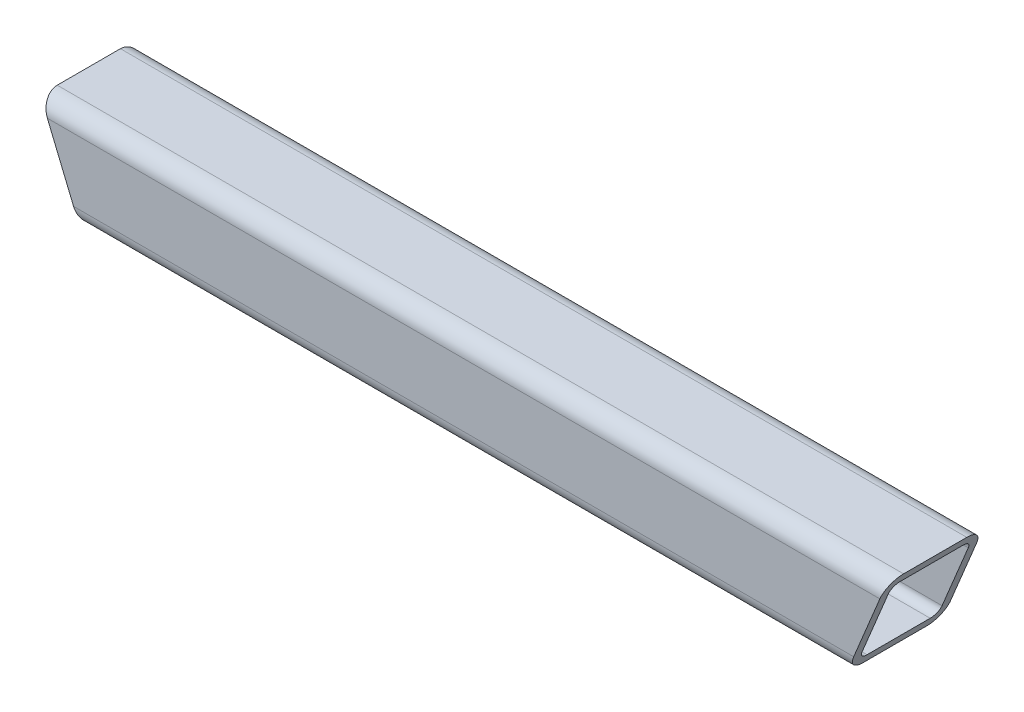
ISO-10303-21;
HEADER;
FILE_DESCRIPTION(('STEP AP214'),'2;1');
FILE_NAME('part.step','',(''),(''),'','','');
FILE_SCHEMA(('AUTOMOTIVE_DESIGN { 1 0 10303 214 1 1 1 1 }'));
ENDSEC;
DATA;
#1=APPLICATION_CONTEXT('core data for automotive mechanical design processes');
#2=APPLICATION_PROTOCOL_DEFINITION('international standard','automotive_design',2000,#1);
#3=PRODUCT_CONTEXT('',#1,'mechanical');
#4=PRODUCT('Part','Part','',(#3));
#5=PRODUCT_RELATED_PRODUCT_CATEGORY('part','',(#4));
#6=PRODUCT_DEFINITION_FORMATION('','',#4);
#7=PRODUCT_DEFINITION_CONTEXT('part definition',#1,'design');
#8=PRODUCT_DEFINITION('design','',#6,#7);
#9=PRODUCT_DEFINITION_SHAPE('','',#8);
#10=(LENGTH_UNIT() NAMED_UNIT(*) SI_UNIT(.MILLI.,.METRE.));
#11=(NAMED_UNIT(*) PLANE_ANGLE_UNIT() SI_UNIT($,.RADIAN.));
#12=(NAMED_UNIT(*) SI_UNIT($,.STERADIAN.) SOLID_ANGLE_UNIT());
#13=UNCERTAINTY_MEASURE_WITH_UNIT(LENGTH_MEASURE(1.E-05),#10,'distance_accuracy_value','');
#14=(GEOMETRIC_REPRESENTATION_CONTEXT(3) GLOBAL_UNCERTAINTY_ASSIGNED_CONTEXT((#13)) GLOBAL_UNIT_ASSIGNED_CONTEXT((#10,
#11,#12)) REPRESENTATION_CONTEXT('',''));
#15=CARTESIAN_POINT('',(0.,0.,0.));
#16=DIRECTION('',(0.,0.,1.));
#17=DIRECTION('',(1.,0.,0.));
#18=AXIS2_PLACEMENT_3D('',#15,#16,#17);
#19=CARTESIAN_POINT('',(124.999999999999,309.8,1415.2));
#20=DIRECTION('',(-1.,0.,0.));
#21=DIRECTION('',(0.,0.,1.));
#22=AXIS2_PLACEMENT_3D('',#19,#20,#21);
#23=CYLINDRICAL_SURFACE('',#22,5.19999999999995);
#24=CARTESIAN_POINT('',(-129.059292911255,309.8,1415.2));
#25=DIRECTION('',(-0.923879532511288,-0.382683432365087,0.));
#26=DIRECTION('',(-0.382683432365087,0.923879532511288,0.));
#27=AXIS2_PLACEMENT_3D('',#24,#25,#26);
#28=ELLIPSE('',#27,5.62843944152039,5.19999999999995);
#29=CARTESIAN_POINT('',(-131.213203435595,315.,1415.2));
#30=VERTEX_POINT('',#29);
#31=CARTESIAN_POINT('',(-129.059292911255,309.8,1410.));
#32=VERTEX_POINT('',#31);
#33=EDGE_CURVE('E183',#30,#32,#28,.T.);
#34=ORIENTED_EDGE('',*,*,#33,.F.);
#35=DIRECTION('',(-1.,0.,0.));
#36=VECTOR('',#35,1.);
#37=CARTESIAN_POINT('',(124.999999999999,315.,1415.2));
#38=LINE('',#37,#36);
#39=CARTESIAN_POINT('',(131.213203435595,315.,1415.2));
#40=VERTEX_POINT('',#39);
#41=EDGE_CURVE('E263',#40,#30,#38,.T.);
#42=ORIENTED_EDGE('',*,*,#41,.F.);
#43=CARTESIAN_POINT('',(129.059292911255,309.8,1415.2));
#44=DIRECTION('',(0.923879532511288,-0.382683432365087,0.));
#45=DIRECTION('',(-0.382683432365087,-0.923879532511288,0.));
#46=AXIS2_PLACEMENT_3D('',#43,#44,#45);
#47=ELLIPSE('',#46,5.62843944152039,5.19999999999995);
#48=CARTESIAN_POINT('',(129.059292911255,309.8,1410.));
#49=VERTEX_POINT('',#48);
#50=EDGE_CURVE('E174',#49,#40,#47,.T.);
#51=ORIENTED_EDGE('',*,*,#50,.F.);
#52=DIRECTION('',(-1.,0.,0.));
#53=VECTOR('',#52,1.);
#54=CARTESIAN_POINT('',(124.999999999999,309.8,1410.));
#55=LINE('',#54,#53);
#56=EDGE_CURVE('E43',#49,#32,#55,.T.);
#57=ORIENTED_EDGE('',*,*,#56,.T.);
#58=EDGE_LOOP('',(#34,#42,#51,#57));
#59=FACE_BOUND('',#58,.T.);
#60=ADVANCED_FACE('F39',(#59),#23,.T.);
#61=CARTESIAN_POINT('',(124.999999999999,315.,1415.2));
#62=DIRECTION('',(0.,-1.,0.));
#63=DIRECTION('',(0.,0.,-1.));
#64=AXIS2_PLACEMENT_3D('',#61,#62,#63);
#65=PLANE('',#64);
#66=DIRECTION('',(0.,0.,-1.));
#67=VECTOR('',#66,1.);
#68=CARTESIAN_POINT('',(-131.213203435595,315.,1415.2));
#69=LINE('',#68,#67);
#70=CARTESIAN_POINT('',(-131.213203435595,315.,1434.8));
#71=VERTEX_POINT('',#70);
#72=EDGE_CURVE('E180',#71,#30,#69,.T.);
#73=ORIENTED_EDGE('',*,*,#72,.F.);
#74=DIRECTION('',(-1.,0.,0.));
#75=VECTOR('',#74,1.);
#76=CARTESIAN_POINT('',(124.999999999999,315.,1434.8));
#77=LINE('',#76,#75);
#78=CARTESIAN_POINT('',(131.213203435595,315.,1434.8));
#79=VERTEX_POINT('',#78);
#80=EDGE_CURVE('E261',#79,#71,#77,.T.);
#81=ORIENTED_EDGE('',*,*,#80,.F.);
#82=DIRECTION('',(0.,0.,1.));
#83=VECTOR('',#82,1.);
#84=CARTESIAN_POINT('',(131.213203435595,315.,1415.2));
#85=LINE('',#84,#83);
#86=EDGE_CURVE('E279',#40,#79,#85,.T.);
#87=ORIENTED_EDGE('',*,*,#86,.F.);
#88=ORIENTED_EDGE('',*,*,#41,.T.);
#89=EDGE_LOOP('',(#73,#81,#87,#88));
#90=FACE_BOUND('',#89,.T.);
#91=ADVANCED_FACE('F270',(#90),#65,.F.);
#92=CARTESIAN_POINT('',(124.999999999999,309.8,1434.8));
#93=DIRECTION('',(-1.,0.,0.));
#94=DIRECTION('',(0.,0.,1.));
#95=AXIS2_PLACEMENT_3D('',#92,#93,#94);
#96=CYLINDRICAL_SURFACE('',#95,5.19999999999995);
#97=CARTESIAN_POINT('',(-129.059292911255,309.8,1434.8));
#98=DIRECTION('',(-0.923879532511288,-0.382683432365087,0.));
#99=DIRECTION('',(-0.382683432365087,0.923879532511288,0.));
#100=AXIS2_PLACEMENT_3D('',#97,#98,#99);
#101=ELLIPSE('',#100,5.62843944152039,5.19999999999995);
#102=CARTESIAN_POINT('',(-129.059292911255,309.8,1440.));
#103=VERTEX_POINT('',#102);
#104=EDGE_CURVE('E11',#103,#71,#101,.T.);
#105=ORIENTED_EDGE('',*,*,#104,.F.);
#106=DIRECTION('',(-1.,0.,0.));
#107=VECTOR('',#106,1.);
#108=CARTESIAN_POINT('',(124.999999999999,309.8,1440.));
#109=LINE('',#108,#107);
#110=CARTESIAN_POINT('',(129.059292911255,309.8,1440.));
#111=VERTEX_POINT('',#110);
#112=EDGE_CURVE('E258',#111,#103,#109,.T.);
#113=ORIENTED_EDGE('',*,*,#112,.F.);
#114=CARTESIAN_POINT('',(129.059292911255,309.8,1434.8));
#115=DIRECTION('',(0.923879532511288,-0.382683432365087,0.));
#116=DIRECTION('',(-0.382683432365087,-0.923879532511288,0.));
#117=AXIS2_PLACEMENT_3D('',#114,#115,#116);
#118=ELLIPSE('',#117,5.62843944152039,5.19999999999995);
#119=EDGE_CURVE('E276',#79,#111,#118,.T.);
#120=ORIENTED_EDGE('',*,*,#119,.F.);
#121=ORIENTED_EDGE('',*,*,#80,.T.);
#122=EDGE_LOOP('',(#105,#113,#120,#121));
#123=FACE_BOUND('',#122,.T.);
#124=ADVANCED_FACE('F273',(#123),#96,.T.);
#125=CARTESIAN_POINT('',(124.999999999999,290.2,1440.));
#126=DIRECTION('',(0.,0.,-1.));
#127=DIRECTION('',(-1.,0.,0.));
#128=AXIS2_PLACEMENT_3D('',#125,#126,#127);
#129=PLANE('',#128);
#130=DIRECTION('',(-0.382683432365087,0.923879532511288,0.));
#131=VECTOR('',#130,1.);
#132=CARTESIAN_POINT('',(-84.9235244205041,203.246829123869,1440.));
#133=LINE('',#132,#131);
#134=CARTESIAN_POINT('',(-120.940707088743,290.2,1440.));
#135=VERTEX_POINT('',#134);
#136=EDGE_CURVE('E49',#135,#103,#133,.T.);
#137=ORIENTED_EDGE('',*,*,#136,.F.);
#138=DIRECTION('',(-1.,0.,0.));
#139=VECTOR('',#138,1.);
#140=CARTESIAN_POINT('',(124.999999999999,290.2,1440.));
#141=LINE('',#140,#139);
#142=CARTESIAN_POINT('',(120.940707088743,290.2,1440.));
#143=VERTEX_POINT('',#142);
#144=EDGE_CURVE('E255',#143,#135,#141,.T.);
#145=ORIENTED_EDGE('',*,*,#144,.F.);
#146=DIRECTION('',(-0.382683432365087,-0.923879532511288,0.));
#147=VECTOR('',#146,1.);
#148=CARTESIAN_POINT('',(121.535176772185,291.635176772186,1440.));
#149=LINE('',#148,#147);
#150=EDGE_CURVE('E278',#111,#143,#149,.T.);
#151=ORIENTED_EDGE('',*,*,#150,.F.);
#152=ORIENTED_EDGE('',*,*,#112,.T.);
#153=EDGE_LOOP('',(#137,#145,#151,#152));
#154=FACE_BOUND('',#153,.T.);
#155=ADVANCED_FACE('F289',(#154),#129,.F.);
#156=CARTESIAN_POINT('',(124.999999999999,290.2,1434.8));
#157=DIRECTION('',(-1.,0.,0.));
#158=DIRECTION('',(0.,0.,1.));
#159=AXIS2_PLACEMENT_3D('',#156,#157,#158);
#160=CYLINDRICAL_SURFACE('',#159,5.19999999999995);
#161=CARTESIAN_POINT('',(-120.940707088743,290.2,1434.8));
#162=DIRECTION('',(-0.923879532511288,-0.382683432365087,0.));
#163=DIRECTION('',(-0.382683432365087,0.923879532511288,0.));
#164=AXIS2_PLACEMENT_3D('',#161,#162,#163);
#165=ELLIPSE('',#164,5.62843944152039,5.19999999999995);
#166=CARTESIAN_POINT('',(-118.786796564403,285.,1434.8));
#167=VERTEX_POINT('',#166);
#168=EDGE_CURVE('E198',#167,#135,#165,.T.);
#169=ORIENTED_EDGE('',*,*,#168,.F.);
#170=DIRECTION('',(-1.,0.,0.));
#171=VECTOR('',#170,1.);
#172=CARTESIAN_POINT('',(124.999999999999,285.,1434.8));
#173=LINE('',#172,#171);
#174=CARTESIAN_POINT('',(118.786796564403,285.,1434.8));
#175=VERTEX_POINT('',#174);
#176=EDGE_CURVE('E252',#175,#167,#173,.T.);
#177=ORIENTED_EDGE('',*,*,#176,.F.);
#178=CARTESIAN_POINT('',(120.940707088743,290.2,1434.8));
#179=DIRECTION('',(0.923879532511288,-0.382683432365087,0.));
#180=DIRECTION('',(-0.382683432365087,-0.923879532511288,0.));
#181=AXIS2_PLACEMENT_3D('',#178,#179,#180);
#182=ELLIPSE('',#181,5.62843944152039,5.19999999999995);
#183=EDGE_CURVE('E185',#143,#175,#182,.T.);
#184=ORIENTED_EDGE('',*,*,#183,.F.);
#185=ORIENTED_EDGE('',*,*,#144,.T.);
#186=EDGE_LOOP('',(#169,#177,#184,#185));
#187=FACE_BOUND('',#186,.T.);
#188=ADVANCED_FACE('F287',(#187),#160,.T.);
#189=CARTESIAN_POINT('',(124.999999999999,285.,1434.8));
#190=DIRECTION('',(0.,1.,0.));
#191=DIRECTION('',(0.,0.,1.));
#192=AXIS2_PLACEMENT_3D('',#189,#190,#191);
#193=PLANE('',#192);
#194=DIRECTION('',(0.,0.,1.));
#195=VECTOR('',#194,1.);
#196=CARTESIAN_POINT('',(-118.786796564403,285.,1434.8));
#197=LINE('',#196,#195);
#198=CARTESIAN_POINT('',(-118.786796564403,285.,1415.2));
#199=VERTEX_POINT('',#198);
#200=EDGE_CURVE('E201',#199,#167,#197,.T.);
#201=ORIENTED_EDGE('',*,*,#200,.F.);
#202=DIRECTION('',(-1.,0.,0.));
#203=VECTOR('',#202,1.);
#204=CARTESIAN_POINT('',(124.999999999999,285.,1415.2));
#205=LINE('',#204,#203);
#206=CARTESIAN_POINT('',(118.786796564403,285.,1415.2));
#207=VERTEX_POINT('',#206);
#208=EDGE_CURVE('E250',#207,#199,#205,.T.);
#209=ORIENTED_EDGE('',*,*,#208,.F.);
#210=DIRECTION('',(0.,0.,-1.));
#211=VECTOR('',#210,1.);
#212=CARTESIAN_POINT('',(118.786796564403,285.,1434.8));
#213=LINE('',#212,#211);
#214=EDGE_CURVE('E179',#175,#207,#213,.T.);
#215=ORIENTED_EDGE('',*,*,#214,.F.);
#216=ORIENTED_EDGE('',*,*,#176,.T.);
#217=EDGE_LOOP('',(#201,#209,#215,#216));
#218=FACE_BOUND('',#217,.T.);
#219=ADVANCED_FACE('F291',(#218),#193,.F.);
#220=CARTESIAN_POINT('',(124.999999999999,290.2,1415.2));
#221=DIRECTION('',(-1.,0.,0.));
#222=DIRECTION('',(0.,0.,1.));
#223=AXIS2_PLACEMENT_3D('',#220,#221,#222);
#224=CYLINDRICAL_SURFACE('',#223,5.19999999999995);
#225=CARTESIAN_POINT('',(-120.940707088743,290.2,1415.2));
#226=DIRECTION('',(-0.923879532511288,-0.382683432365087,0.));
#227=DIRECTION('',(-0.382683432365087,0.923879532511288,0.));
#228=AXIS2_PLACEMENT_3D('',#225,#226,#227);
#229=ELLIPSE('',#228,5.62843944152039,5.19999999999995);
#230=CARTESIAN_POINT('',(-120.940707088743,290.2,1410.));
#231=VERTEX_POINT('',#230);
#232=EDGE_CURVE('E162',#231,#199,#229,.T.);
#233=ORIENTED_EDGE('',*,*,#232,.F.);
#234=DIRECTION('',(-1.,0.,0.));
#235=VECTOR('',#234,1.);
#236=CARTESIAN_POINT('',(124.999999999999,290.2,1410.));
#237=LINE('',#236,#235);
#238=CARTESIAN_POINT('',(120.940707088743,290.2,1410.));
#239=VERTEX_POINT('',#238);
#240=EDGE_CURVE('E154',#239,#231,#237,.T.);
#241=ORIENTED_EDGE('',*,*,#240,.F.);
#242=CARTESIAN_POINT('',(120.940707088743,290.2,1415.2));
#243=DIRECTION('',(0.923879532511288,-0.382683432365087,0.));
#244=DIRECTION('',(-0.382683432365087,-0.923879532511288,0.));
#245=AXIS2_PLACEMENT_3D('',#242,#243,#244);
#246=ELLIPSE('',#245,5.62843944152039,5.19999999999995);
#247=EDGE_CURVE('E159',#207,#239,#246,.T.);
#248=ORIENTED_EDGE('',*,*,#247,.F.);
#249=ORIENTED_EDGE('',*,*,#208,.T.);
#250=EDGE_LOOP('',(#233,#241,#248,#249));
#251=FACE_BOUND('',#250,.T.);
#252=ADVANCED_FACE('F156',(#251),#224,.T.);
#253=CARTESIAN_POINT('',(124.999999999999,309.8,1434.8));
#254=DIRECTION('',(-1.,0.,0.));
#255=DIRECTION('',(0.,0.,1.));
#256=AXIS2_PLACEMENT_3D('',#253,#254,#255);
#257=CYLINDRICAL_SURFACE('',#256,2.59999999999999);
#258=DIRECTION('',(-1.,0.,0.));
#259=VECTOR('',#258,1.);
#260=CARTESIAN_POINT('',(124.999999999999,309.8,1437.4));
#261=LINE('',#260,#259);
#262=CARTESIAN_POINT('',(129.059292911255,309.8,1437.4));
#263=VERTEX_POINT('',#262);
#264=CARTESIAN_POINT('',(-129.059292911255,309.8,1437.4));
#265=VERTEX_POINT('',#264);
#266=EDGE_CURVE('E207',#263,#265,#261,.T.);
#267=ORIENTED_EDGE('',*,*,#266,.T.);
#268=CARTESIAN_POINT('',(-129.059292911255,309.8,1434.8));
#269=DIRECTION('',(-0.923879532511288,-0.382683432365087,0.));
#270=DIRECTION('',(-0.382683432365087,0.923879532511288,0.));
#271=AXIS2_PLACEMENT_3D('',#268,#269,#270);
#272=ELLIPSE('',#271,2.81421972076021,2.59999999999999);
#273=CARTESIAN_POINT('',(-130.136248173425,312.4,1434.8));
#274=VERTEX_POINT('',#273);
#275=EDGE_CURVE('E85',#265,#274,#272,.T.);
#276=ORIENTED_EDGE('',*,*,#275,.T.);
#277=DIRECTION('',(-1.,0.,0.));
#278=VECTOR('',#277,1.);
#279=CARTESIAN_POINT('',(124.999999999999,312.4,1434.8));
#280=LINE('',#279,#278);
#281=CARTESIAN_POINT('',(130.136248173425,312.4,1434.8));
#282=VERTEX_POINT('',#281);
#283=EDGE_CURVE('E210',#282,#274,#280,.T.);
#284=ORIENTED_EDGE('',*,*,#283,.F.);
#285=CARTESIAN_POINT('',(129.059292911255,309.8,1434.8));
#286=DIRECTION('',(0.923879532511288,-0.382683432365087,0.));
#287=DIRECTION('',(-0.382683432365087,-0.923879532511288,0.));
#288=AXIS2_PLACEMENT_3D('',#285,#286,#287);
#289=ELLIPSE('',#288,2.81421972076021,2.59999999999999);
#290=EDGE_CURVE('E206',#282,#263,#289,.T.);
#291=ORIENTED_EDGE('',*,*,#290,.T.);
#292=EDGE_LOOP('',(#267,#276,#284,#291));
#293=FACE_BOUND('',#292,.T.);
#294=ADVANCED_FACE('F299',(#293),#257,.F.);
#295=CARTESIAN_POINT('',(124.999999999999,312.4,1415.2));
#296=DIRECTION('',(0.,-1.,0.));
#297=DIRECTION('',(0.,0.,-1.));
#298=AXIS2_PLACEMENT_3D('',#295,#296,#297);
#299=PLANE('',#298);
#300=ORIENTED_EDGE('',*,*,#283,.T.);
#301=DIRECTION('',(0.,0.,-1.));
#302=VECTOR('',#301,1.);
#303=CARTESIAN_POINT('',(-130.136248173425,312.4,1415.2));
#304=LINE('',#303,#302);
#305=CARTESIAN_POINT('',(-130.136248173425,312.4,1415.2));
#306=VERTEX_POINT('',#305);
#307=EDGE_CURVE('E58',#274,#306,#304,.T.);
#308=ORIENTED_EDGE('',*,*,#307,.T.);
#309=DIRECTION('',(-1.,0.,0.));
#310=VECTOR('',#309,1.);
#311=CARTESIAN_POINT('',(124.999999999999,312.4,1415.2));
#312=LINE('',#311,#310);
#313=CARTESIAN_POINT('',(130.136248173425,312.4,1415.2));
#314=VERTEX_POINT('',#313);
#315=EDGE_CURVE('E215',#314,#306,#312,.T.);
#316=ORIENTED_EDGE('',*,*,#315,.F.);
#317=DIRECTION('',(0.,0.,1.));
#318=VECTOR('',#317,1.);
#319=CARTESIAN_POINT('',(130.136248173425,312.4,1415.2));
#320=LINE('',#319,#318);
#321=EDGE_CURVE('E209',#314,#282,#320,.T.);
#322=ORIENTED_EDGE('',*,*,#321,.T.);
#323=EDGE_LOOP('',(#300,#308,#316,#322));
#324=FACE_BOUND('',#323,.T.);
#325=ADVANCED_FACE('F347',(#324),#299,.T.);
#326=CARTESIAN_POINT('',(124.999999999999,309.8,1415.2));
#327=DIRECTION('',(-1.,0.,0.));
#328=DIRECTION('',(0.,0.,1.));
#329=AXIS2_PLACEMENT_3D('',#326,#327,#328);
#330=CYLINDRICAL_SURFACE('',#329,2.59999999999999);
#331=ORIENTED_EDGE('',*,*,#315,.T.);
#332=CARTESIAN_POINT('',(-129.059292911255,309.8,1415.2));
#333=DIRECTION('',(-0.923879532511288,-0.382683432365087,0.));
#334=DIRECTION('',(-0.382683432365087,0.923879532511288,0.));
#335=AXIS2_PLACEMENT_3D('',#332,#333,#334);
#336=ELLIPSE('',#335,2.81421972076021,2.59999999999999);
#337=CARTESIAN_POINT('',(-129.059292911255,309.8,1412.6));
#338=VERTEX_POINT('',#337);
#339=EDGE_CURVE('E211',#306,#338,#336,.T.);
#340=ORIENTED_EDGE('',*,*,#339,.T.);
#341=DIRECTION('',(-1.,0.,0.));
#342=VECTOR('',#341,1.);
#343=CARTESIAN_POINT('',(124.999999999999,309.8,1412.6));
#344=LINE('',#343,#342);
#345=CARTESIAN_POINT('',(129.059292911255,309.8,1412.6));
#346=VERTEX_POINT('',#345);
#347=EDGE_CURVE('E220',#346,#338,#344,.T.);
#348=ORIENTED_EDGE('',*,*,#347,.F.);
#349=CARTESIAN_POINT('',(129.059292911255,309.8,1415.2));
#350=DIRECTION('',(0.923879532511288,-0.382683432365087,0.));
#351=DIRECTION('',(-0.382683432365087,-0.923879532511288,0.));
#352=AXIS2_PLACEMENT_3D('',#349,#350,#351);
#353=ELLIPSE('',#352,2.81421972076021,2.59999999999999);
#354=EDGE_CURVE('E214',#346,#314,#353,.T.);
#355=ORIENTED_EDGE('',*,*,#354,.T.);
#356=EDGE_LOOP('',(#331,#340,#348,#355));
#357=FACE_BOUND('',#356,.T.);
#358=ADVANCED_FACE('F355',(#357),#330,.F.);
#359=CARTESIAN_POINT('',(124.999999999999,309.8,1412.6));
#360=DIRECTION('',(0.,0.,1.));
#361=DIRECTION('',(1.,0.,0.));
#362=AXIS2_PLACEMENT_3D('',#359,#360,#361);
#363=PLANE('',#362);
#364=ORIENTED_EDGE('',*,*,#347,.T.);
#365=DIRECTION('',(0.382683432365087,-0.923879532511288,0.));
#366=VECTOR('',#365,1.);
#367=CARTESIAN_POINT('',(-91.8531708761322,219.976475579497,1412.6));
#368=LINE('',#367,#366);
#369=CARTESIAN_POINT('',(-120.940707088743,290.2,1412.6));
#370=VERTEX_POINT('',#369);
#371=EDGE_CURVE('E216',#338,#370,#368,.T.);
#372=ORIENTED_EDGE('',*,*,#371,.T.);
#373=DIRECTION('',(-1.,0.,0.));
#374=VECTOR('',#373,1.);
#375=CARTESIAN_POINT('',(124.999999999999,290.2,1412.6));
#376=LINE('',#375,#374);
#377=CARTESIAN_POINT('',(120.940707088743,290.2,1412.6));
#378=VERTEX_POINT('',#377);
#379=EDGE_CURVE('E225',#378,#370,#376,.T.);
#380=ORIENTED_EDGE('',*,*,#379,.F.);
#381=DIRECTION('',(0.382683432365087,0.923879532511288,0.));
#382=VECTOR('',#381,1.);
#383=CARTESIAN_POINT('',(128.464823227813,308.364823227814,1412.6));
#384=LINE('',#383,#382);
#385=EDGE_CURVE('E219',#378,#346,#384,.T.);
#386=ORIENTED_EDGE('',*,*,#385,.T.);
#387=EDGE_LOOP('',(#364,#372,#380,#386));
#388=FACE_BOUND('',#387,.T.);
#389=ADVANCED_FACE('F363',(#388),#363,.T.);
#390=CARTESIAN_POINT('',(124.999999999999,290.2,1415.2));
#391=DIRECTION('',(-1.,0.,0.));
#392=DIRECTION('',(0.,0.,1.));
#393=AXIS2_PLACEMENT_3D('',#390,#391,#392);
#394=CYLINDRICAL_SURFACE('',#393,2.59999999999999);
#395=ORIENTED_EDGE('',*,*,#379,.T.);
#396=CARTESIAN_POINT('',(-120.940707088743,290.2,1415.2));
#397=DIRECTION('',(-0.923879532511288,-0.382683432365087,0.));
#398=DIRECTION('',(-0.382683432365087,0.923879532511288,0.));
#399=AXIS2_PLACEMENT_3D('',#396,#397,#398);
#400=ELLIPSE('',#399,2.81421972076021,2.59999999999999);
#401=CARTESIAN_POINT('',(-119.863751826573,287.6,1415.2));
#402=VERTEX_POINT('',#401);
#403=EDGE_CURVE('E221',#370,#402,#400,.T.);
#404=ORIENTED_EDGE('',*,*,#403,.T.);
#405=DIRECTION('',(-1.,0.,0.));
#406=VECTOR('',#405,1.);
#407=CARTESIAN_POINT('',(124.999999999999,287.6,1415.2));
#408=LINE('',#407,#406);
#409=CARTESIAN_POINT('',(119.863751826573,287.6,1415.2));
#410=VERTEX_POINT('',#409);
#411=EDGE_CURVE('E230',#410,#402,#408,.T.);
#412=ORIENTED_EDGE('',*,*,#411,.F.);
#413=CARTESIAN_POINT('',(120.940707088743,290.2,1415.2));
#414=DIRECTION('',(0.923879532511288,-0.382683432365087,0.));
#415=DIRECTION('',(-0.382683432365087,-0.923879532511288,0.));
#416=AXIS2_PLACEMENT_3D('',#413,#414,#415);
#417=ELLIPSE('',#416,2.81421972076021,2.59999999999999);
#418=EDGE_CURVE('E224',#410,#378,#417,.T.);
#419=ORIENTED_EDGE('',*,*,#418,.T.);
#420=EDGE_LOOP('',(#395,#404,#412,#419));
#421=FACE_BOUND('',#420,.T.);
#422=ADVANCED_FACE('F371',(#421),#394,.F.);
#423=CARTESIAN_POINT('',(124.999999999999,287.6,1434.8));
#424=DIRECTION('',(0.,1.,0.));
#425=DIRECTION('',(0.,0.,1.));
#426=AXIS2_PLACEMENT_3D('',#423,#424,#425);
#427=PLANE('',#426);
#428=ORIENTED_EDGE('',*,*,#411,.T.);
#429=DIRECTION('',(0.,0.,1.));
#430=VECTOR('',#429,1.);
#431=CARTESIAN_POINT('',(-119.863751826573,287.6,1434.8));
#432=LINE('',#431,#430);
#433=CARTESIAN_POINT('',(-119.863751826573,287.6,1434.8));
#434=VERTEX_POINT('',#433);
#435=EDGE_CURVE('E226',#402,#434,#432,.T.);
#436=ORIENTED_EDGE('',*,*,#435,.T.);
#437=DIRECTION('',(-1.,0.,0.));
#438=VECTOR('',#437,1.);
#439=CARTESIAN_POINT('',(124.999999999999,287.6,1434.8));
#440=LINE('',#439,#438);
#441=CARTESIAN_POINT('',(119.863751826573,287.6,1434.8));
#442=VERTEX_POINT('',#441);
#443=EDGE_CURVE('E234',#442,#434,#440,.T.);
#444=ORIENTED_EDGE('',*,*,#443,.F.);
#445=DIRECTION('',(0.,0.,-1.));
#446=VECTOR('',#445,1.);
#447=CARTESIAN_POINT('',(119.863751826573,287.6,1434.8));
#448=LINE('',#447,#446);
#449=EDGE_CURVE('E229',#442,#410,#448,.T.);
#450=ORIENTED_EDGE('',*,*,#449,.T.);
#451=EDGE_LOOP('',(#428,#436,#444,#450));
#452=FACE_BOUND('',#451,.T.);
#453=ADVANCED_FACE('F379',(#452),#427,.T.);
#454=CARTESIAN_POINT('',(124.999999999999,290.2,1434.8));
#455=DIRECTION('',(-1.,0.,0.));
#456=DIRECTION('',(0.,0.,1.));
#457=AXIS2_PLACEMENT_3D('',#454,#455,#456);
#458=CYLINDRICAL_SURFACE('',#457,2.59999999999999);
#459=ORIENTED_EDGE('',*,*,#443,.T.);
#460=CARTESIAN_POINT('',(-120.940707088743,290.2,1434.8));
#461=DIRECTION('',(-0.923879532511288,-0.382683432365087,0.));
#462=DIRECTION('',(-0.382683432365087,0.923879532511288,0.));
#463=AXIS2_PLACEMENT_3D('',#460,#461,#462);
#464=ELLIPSE('',#463,2.81421972076021,2.59999999999999);
#465=CARTESIAN_POINT('',(-120.940707088743,290.2,1437.4));
#466=VERTEX_POINT('',#465);
#467=EDGE_CURVE('E231',#434,#466,#464,.T.);
#468=ORIENTED_EDGE('',*,*,#467,.T.);
#469=DIRECTION('',(-1.,0.,0.));
#470=VECTOR('',#469,1.);
#471=CARTESIAN_POINT('',(124.999999999999,290.2,1437.4));
#472=LINE('',#471,#470);
#473=CARTESIAN_POINT('',(120.940707088743,290.2,1437.4));
#474=VERTEX_POINT('',#473);
#475=EDGE_CURVE('E192',#474,#466,#472,.T.);
#476=ORIENTED_EDGE('',*,*,#475,.F.);
#477=CARTESIAN_POINT('',(120.940707088743,290.2,1434.8));
#478=DIRECTION('',(0.923879532511288,-0.382683432365087,0.));
#479=DIRECTION('',(-0.382683432365087,-0.923879532511288,0.));
#480=AXIS2_PLACEMENT_3D('',#477,#478,#479);
#481=ELLIPSE('',#480,2.81421972076021,2.59999999999999);
#482=EDGE_CURVE('E233',#474,#442,#481,.T.);
#483=ORIENTED_EDGE('',*,*,#482,.T.);
#484=EDGE_LOOP('',(#459,#468,#476,#483));
#485=FACE_BOUND('',#484,.T.);
#486=ADVANCED_FACE('F387',(#485),#458,.F.);
#487=CARTESIAN_POINT('',(124.999999999999,290.2,1437.4));
#488=DIRECTION('',(0.,0.,-1.));
#489=DIRECTION('',(-1.,0.,0.));
#490=AXIS2_PLACEMENT_3D('',#487,#488,#489);
#491=PLANE('',#490);
#492=ORIENTED_EDGE('',*,*,#475,.T.);
#493=DIRECTION('',(-0.382683432365087,0.923879532511288,0.));
#494=VECTOR('',#493,1.);
#495=CARTESIAN_POINT('',(-84.9235244205041,203.246829123869,1437.4));
#496=LINE('',#495,#494);
#497=EDGE_CURVE('E80',#466,#265,#496,.T.);
#498=ORIENTED_EDGE('',*,*,#497,.T.);
#499=ORIENTED_EDGE('',*,*,#266,.F.);
#500=DIRECTION('',(-0.382683432365087,-0.923879532511288,0.));
#501=VECTOR('',#500,1.);
#502=CARTESIAN_POINT('',(121.535176772185,291.635176772186,1437.4));
#503=LINE('',#502,#501);
#504=EDGE_CURVE('E167',#263,#474,#503,.T.);
#505=ORIENTED_EDGE('',*,*,#504,.T.);
#506=EDGE_LOOP('',(#492,#498,#499,#505));
#507=FACE_BOUND('',#506,.T.);
#508=ADVANCED_FACE('F395',(#507),#491,.T.);
#509=CARTESIAN_POINT('',(124.999999999999,309.8,1410.));
#510=DIRECTION('',(0.,0.,1.));
#511=DIRECTION('',(1.,0.,0.));
#512=AXIS2_PLACEMENT_3D('',#509,#510,#511);
#513=PLANE('',#512);
#514=DIRECTION('',(0.382683432365087,-0.923879532511288,0.));
#515=VECTOR('',#514,1.);
#516=CARTESIAN_POINT('',(-91.8531708761322,219.976475579497,1410.));
#517=LINE('',#516,#515);
#518=EDGE_CURVE('E194',#32,#231,#517,.T.);
#519=ORIENTED_EDGE('',*,*,#518,.F.);
#520=ORIENTED_EDGE('',*,*,#56,.F.);
#521=DIRECTION('',(0.382683432365087,0.923879532511288,0.));
#522=VECTOR('',#521,1.);
#523=CARTESIAN_POINT('',(128.464823227813,308.364823227814,1410.));
#524=LINE('',#523,#522);
#525=EDGE_CURVE('E166',#239,#49,#524,.T.);
#526=ORIENTED_EDGE('',*,*,#525,.F.);
#527=ORIENTED_EDGE('',*,*,#240,.T.);
#528=EDGE_LOOP('',(#519,#520,#526,#527));
#529=FACE_BOUND('',#528,.T.);
#530=ADVANCED_FACE('F170',(#529),#513,.F.);
#531=CARTESIAN_POINT('',(124.999999999999,300.,1425.));
#532=DIRECTION('',(0.923879532511288,-0.382683432365087,0.));
#533=DIRECTION('',(0.382683432365087,0.923879532511288,0.));
#534=AXIS2_PLACEMENT_3D('',#531,#532,#533);
#535=PLANE('',#534);
#536=ORIENTED_EDGE('',*,*,#290,.F.);
#537=ORIENTED_EDGE('',*,*,#321,.F.);
#538=ORIENTED_EDGE('',*,*,#354,.F.);
#539=ORIENTED_EDGE('',*,*,#385,.F.);
#540=ORIENTED_EDGE('',*,*,#418,.F.);
#541=ORIENTED_EDGE('',*,*,#449,.F.);
#542=ORIENTED_EDGE('',*,*,#482,.F.);
#543=ORIENTED_EDGE('',*,*,#504,.F.);
#544=EDGE_LOOP('',(#536,#537,#538,#539,#540,#541,#542,#543));
#545=FACE_BOUND('',#544,.T.);
#546=ORIENTED_EDGE('',*,*,#525,.T.);
#547=ORIENTED_EDGE('',*,*,#50,.T.);
#548=ORIENTED_EDGE('',*,*,#86,.T.);
#549=ORIENTED_EDGE('',*,*,#119,.T.);
#550=ORIENTED_EDGE('',*,*,#150,.T.);
#551=ORIENTED_EDGE('',*,*,#183,.T.);
#552=ORIENTED_EDGE('',*,*,#214,.T.);
#553=ORIENTED_EDGE('',*,*,#247,.T.);
#554=EDGE_LOOP('',(#546,#547,#548,#549,#550,#551,#552,#553));
#555=FACE_BOUND('',#554,.T.);
#556=ADVANCED_FACE('F177',(#545,#555),#535,.T.);
#557=CARTESIAN_POINT('',(-124.999999999999,300.,1425.));
#558=DIRECTION('',(-0.923879532511288,-0.382683432365087,0.));
#559=DIRECTION('',(0.382683432365087,-0.923879532511288,0.));
#560=AXIS2_PLACEMENT_3D('',#557,#558,#559);
#561=PLANE('',#560);
#562=ORIENTED_EDGE('',*,*,#275,.F.);
#563=ORIENTED_EDGE('',*,*,#497,.F.);
#564=ORIENTED_EDGE('',*,*,#467,.F.);
#565=ORIENTED_EDGE('',*,*,#435,.F.);
#566=ORIENTED_EDGE('',*,*,#403,.F.);
#567=ORIENTED_EDGE('',*,*,#371,.F.);
#568=ORIENTED_EDGE('',*,*,#339,.F.);
#569=ORIENTED_EDGE('',*,*,#307,.F.);
#570=EDGE_LOOP('',(#562,#563,#564,#565,#566,#567,#568,#569));
#571=FACE_BOUND('',#570,.T.);
#572=ORIENTED_EDGE('',*,*,#72,.T.);
#573=ORIENTED_EDGE('',*,*,#33,.T.);
#574=ORIENTED_EDGE('',*,*,#518,.T.);
#575=ORIENTED_EDGE('',*,*,#232,.T.);
#576=ORIENTED_EDGE('',*,*,#200,.T.);
#577=ORIENTED_EDGE('',*,*,#168,.T.);
#578=ORIENTED_EDGE('',*,*,#136,.T.);
#579=ORIENTED_EDGE('',*,*,#104,.T.);
#580=EDGE_LOOP('',(#572,#573,#574,#575,#576,#577,#578,#579));
#581=FACE_BOUND('',#580,.T.);
#582=ADVANCED_FACE('F41',(#571,#581),#561,.T.);
#583=CLOSED_SHELL('',(#60,#91,#124,#155,#188,#219,#252,#294,#325,#358,#389,#422,#453,#486,#508,
#530,#556,#582));
#584=MANIFOLD_SOLID_BREP('B2',#583);
#585=ADVANCED_BREP_SHAPE_REPRESENTATION('',(#18,#584),#14);
#586=SHAPE_DEFINITION_REPRESENTATION(#9,#585);
ENDSEC;
END-ISO-10303-21;
